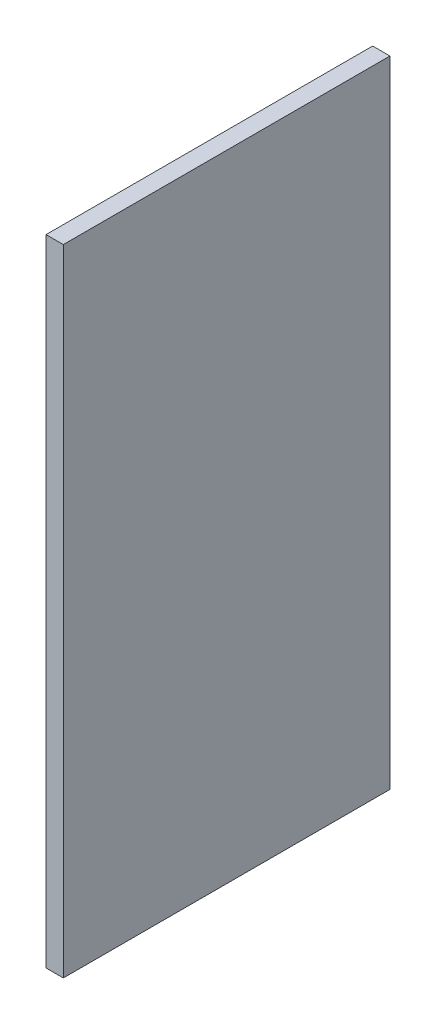
ISO-10303-21;
HEADER;
FILE_DESCRIPTION(('STEP AP214'),'2;1');
FILE_NAME('part.step','',(''),(''),'','','');
FILE_SCHEMA(('AUTOMOTIVE_DESIGN { 1 0 10303 214 1 1 1 1 }'));
ENDSEC;
DATA;
#1=APPLICATION_CONTEXT('core data for automotive mechanical design processes');
#2=APPLICATION_PROTOCOL_DEFINITION('international standard','automotive_design',2000,#1);
#3=PRODUCT_CONTEXT('',#1,'mechanical');
#4=PRODUCT('Part','Part','',(#3));
#5=PRODUCT_RELATED_PRODUCT_CATEGORY('part','',(#4));
#6=PRODUCT_DEFINITION_FORMATION('','',#4);
#7=PRODUCT_DEFINITION_CONTEXT('part definition',#1,'design');
#8=PRODUCT_DEFINITION('design','',#6,#7);
#9=PRODUCT_DEFINITION_SHAPE('','',#8);
#10=(LENGTH_UNIT() NAMED_UNIT(*) SI_UNIT(.MILLI.,.METRE.));
#11=(NAMED_UNIT(*) PLANE_ANGLE_UNIT() SI_UNIT($,.RADIAN.));
#12=(NAMED_UNIT(*) SI_UNIT($,.STERADIAN.) SOLID_ANGLE_UNIT());
#13=UNCERTAINTY_MEASURE_WITH_UNIT(LENGTH_MEASURE(1.E-05),#10,'distance_accuracy_value','');
#14=(GEOMETRIC_REPRESENTATION_CONTEXT(3) GLOBAL_UNCERTAINTY_ASSIGNED_CONTEXT((#13)) GLOBAL_UNIT_ASSIGNED_CONTEXT((#10,
#11,#12)) REPRESENTATION_CONTEXT('',''));
#15=CARTESIAN_POINT('',(0.,0.,0.));
#16=DIRECTION('',(0.,0.,1.));
#17=DIRECTION('',(1.,0.,0.));
#18=AXIS2_PLACEMENT_3D('',#15,#16,#17);
#19=CARTESIAN_POINT('',(4.7625,-175.,-90.));
#20=DIRECTION('',(0.,0.,1.));
#21=DIRECTION('',(1.,0.,0.));
#22=AXIS2_PLACEMENT_3D('',#19,#20,#21);
#23=PLANE('',#22);
#24=DIRECTION('',(0.,1.,0.));
#25=VECTOR('',#24,1.);
#26=CARTESIAN_POINT('',(-4.7625,-175.,-90.));
#27=LINE('',#26,#25);
#28=CARTESIAN_POINT('',(-4.7625,-175.,-90.));
#29=VERTEX_POINT('',#28);
#30=CARTESIAN_POINT('',(-4.7625,175.,-90.));
#31=VERTEX_POINT('',#30);
#32=EDGE_CURVE('E107',#29,#31,#27,.T.);
#33=ORIENTED_EDGE('',*,*,#32,.T.);
#34=DIRECTION('',(-1.,0.,0.));
#35=VECTOR('',#34,1.);
#36=CARTESIAN_POINT('',(4.7625,175.,-90.));
#37=LINE('',#36,#35);
#38=CARTESIAN_POINT('',(4.7625,175.,-90.));
#39=VERTEX_POINT('',#38);
#40=EDGE_CURVE('E11',#39,#31,#37,.T.);
#41=ORIENTED_EDGE('',*,*,#40,.F.);
#42=DIRECTION('',(0.,1.,0.));
#43=VECTOR('',#42,1.);
#44=CARTESIAN_POINT('',(4.7625,-175.,-90.));
#45=LINE('',#44,#43);
#46=CARTESIAN_POINT('',(4.7625,-175.,-90.));
#47=VERTEX_POINT('',#46);
#48=EDGE_CURVE('E91',#47,#39,#45,.T.);
#49=ORIENTED_EDGE('',*,*,#48,.F.);
#50=DIRECTION('',(-1.,0.,0.));
#51=VECTOR('',#50,1.);
#52=CARTESIAN_POINT('',(4.7625,-175.,-90.));
#53=LINE('',#52,#51);
#54=EDGE_CURVE('E103',#47,#29,#53,.T.);
#55=ORIENTED_EDGE('',*,*,#54,.T.);
#56=EDGE_LOOP('',(#33,#41,#49,#55));
#57=FACE_BOUND('',#56,.T.);
#58=ADVANCED_FACE('F39',(#57),#23,.F.);
#59=CARTESIAN_POINT('',(4.7625,175.,90.));
#60=DIRECTION('',(0.,-1.,0.));
#61=DIRECTION('',(0.,0.,-1.));
#62=AXIS2_PLACEMENT_3D('',#59,#60,#61);
#63=PLANE('',#62);
#64=DIRECTION('',(0.,0.,1.));
#65=VECTOR('',#64,1.);
#66=CARTESIAN_POINT('',(-4.7625,175.,90.));
#67=LINE('',#66,#65);
#68=CARTESIAN_POINT('',(-4.7625,175.,90.));
#69=VERTEX_POINT('',#68);
#70=EDGE_CURVE('E96',#31,#69,#67,.T.);
#71=ORIENTED_EDGE('',*,*,#70,.T.);
#72=DIRECTION('',(-1.,0.,0.));
#73=VECTOR('',#72,1.);
#74=CARTESIAN_POINT('',(4.7625,175.,90.));
#75=LINE('',#74,#73);
#76=CARTESIAN_POINT('',(4.7625,175.,90.));
#77=VERTEX_POINT('',#76);
#78=EDGE_CURVE('E48',#77,#69,#75,.T.);
#79=ORIENTED_EDGE('',*,*,#78,.F.);
#80=DIRECTION('',(0.,0.,1.));
#81=VECTOR('',#80,1.);
#82=CARTESIAN_POINT('',(4.7625,175.,90.));
#83=LINE('',#82,#81);
#84=EDGE_CURVE('E86',#39,#77,#83,.T.);
#85=ORIENTED_EDGE('',*,*,#84,.F.);
#86=ORIENTED_EDGE('',*,*,#40,.T.);
#87=EDGE_LOOP('',(#71,#79,#85,#86));
#88=FACE_BOUND('',#87,.T.);
#89=ADVANCED_FACE('F95',(#88),#63,.F.);
#90=CARTESIAN_POINT('',(4.7625,-175.,90.));
#91=DIRECTION('',(0.,0.,-1.));
#92=DIRECTION('',(-1.,0.,0.));
#93=AXIS2_PLACEMENT_3D('',#90,#91,#92);
#94=PLANE('',#93);
#95=DIRECTION('',(0.,-1.,0.));
#96=VECTOR('',#95,1.);
#97=CARTESIAN_POINT('',(-4.7625,-175.,90.));
#98=LINE('',#97,#96);
#99=CARTESIAN_POINT('',(-4.7625,-175.,90.));
#100=VERTEX_POINT('',#99);
#101=EDGE_CURVE('E73',#69,#100,#98,.T.);
#102=ORIENTED_EDGE('',*,*,#101,.T.);
#103=DIRECTION('',(-1.,0.,0.));
#104=VECTOR('',#103,1.);
#105=CARTESIAN_POINT('',(4.7625,-175.,90.));
#106=LINE('',#105,#104);
#107=CARTESIAN_POINT('',(4.7625,-175.,90.));
#108=VERTEX_POINT('',#107);
#109=EDGE_CURVE('E98',#108,#100,#106,.T.);
#110=ORIENTED_EDGE('',*,*,#109,.F.);
#111=DIRECTION('',(0.,-1.,0.));
#112=VECTOR('',#111,1.);
#113=CARTESIAN_POINT('',(4.7625,-175.,90.));
#114=LINE('',#113,#112);
#115=EDGE_CURVE('E89',#77,#108,#114,.T.);
#116=ORIENTED_EDGE('',*,*,#115,.F.);
#117=ORIENTED_EDGE('',*,*,#78,.T.);
#118=EDGE_LOOP('',(#102,#110,#116,#117));
#119=FACE_BOUND('',#118,.T.);
#120=ADVANCED_FACE('F99',(#119),#94,.F.);
#121=CARTESIAN_POINT('',(4.7625,-175.,90.));
#122=DIRECTION('',(0.,1.,0.));
#123=DIRECTION('',(0.,0.,1.));
#124=AXIS2_PLACEMENT_3D('',#121,#122,#123);
#125=PLANE('',#124);
#126=DIRECTION('',(0.,0.,-1.));
#127=VECTOR('',#126,1.);
#128=CARTESIAN_POINT('',(-4.7625,-175.,90.));
#129=LINE('',#128,#127);
#130=EDGE_CURVE('E79',#100,#29,#129,.T.);
#131=ORIENTED_EDGE('',*,*,#130,.T.);
#132=ORIENTED_EDGE('',*,*,#54,.F.);
#133=DIRECTION('',(0.,0.,-1.));
#134=VECTOR('',#133,1.);
#135=CARTESIAN_POINT('',(4.7625,-175.,90.));
#136=LINE('',#135,#134);
#137=EDGE_CURVE('E56',#108,#47,#136,.T.);
#138=ORIENTED_EDGE('',*,*,#137,.F.);
#139=ORIENTED_EDGE('',*,*,#109,.T.);
#140=EDGE_LOOP('',(#131,#132,#138,#139));
#141=FACE_BOUND('',#140,.T.);
#142=ADVANCED_FACE('F120',(#141),#125,.F.);
#143=CARTESIAN_POINT('',(4.7625,0.,0.));
#144=DIRECTION('',(-1.,0.,0.));
#145=DIRECTION('',(0.,0.,1.));
#146=AXIS2_PLACEMENT_3D('',#143,#144,#145);
#147=PLANE('',#146);
#148=ORIENTED_EDGE('',*,*,#48,.T.);
#149=ORIENTED_EDGE('',*,*,#84,.T.);
#150=ORIENTED_EDGE('',*,*,#115,.T.);
#151=ORIENTED_EDGE('',*,*,#137,.T.);
#152=EDGE_LOOP('',(#148,#149,#150,#151));
#153=FACE_BOUND('',#152,.T.);
#154=ADVANCED_FACE('F87',(#153),#147,.F.);
#155=CARTESIAN_POINT('',(-4.7625,0.,0.));
#156=DIRECTION('',(-1.,0.,0.));
#157=DIRECTION('',(0.,0.,1.));
#158=AXIS2_PLACEMENT_3D('',#155,#156,#157);
#159=PLANE('',#158);
#160=ORIENTED_EDGE('',*,*,#32,.F.);
#161=ORIENTED_EDGE('',*,*,#130,.F.);
#162=ORIENTED_EDGE('',*,*,#101,.F.);
#163=ORIENTED_EDGE('',*,*,#70,.F.);
#164=EDGE_LOOP('',(#160,#161,#162,#163));
#165=FACE_BOUND('',#164,.T.);
#166=ADVANCED_FACE('F123',(#165),#159,.T.);
#167=CLOSED_SHELL('',(#58,#89,#120,#142,#154,#166));
#168=MANIFOLD_SOLID_BREP('B2',#167);
#169=ADVANCED_BREP_SHAPE_REPRESENTATION('',(#18,#168),#14);
#170=SHAPE_DEFINITION_REPRESENTATION(#9,#169);
ENDSEC;
END-ISO-10303-21;
